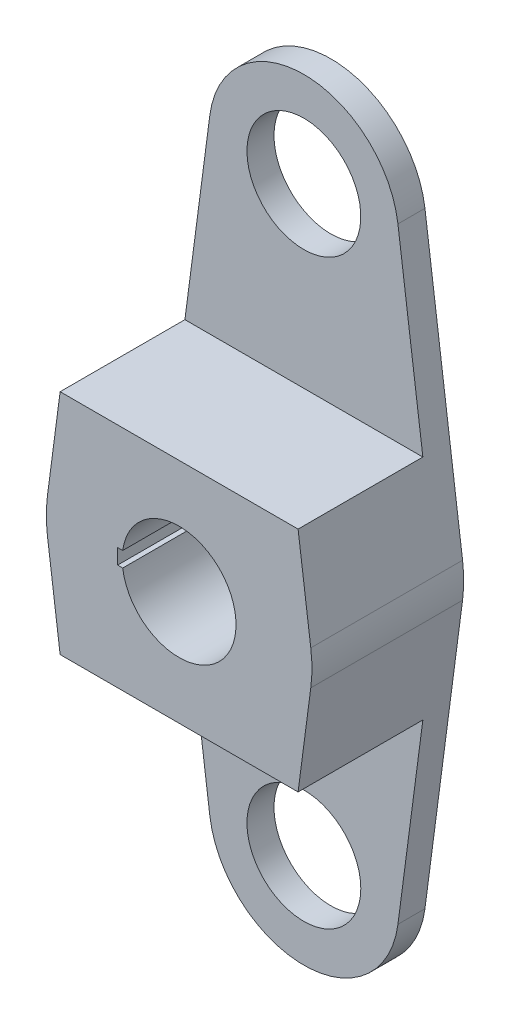
ISO-10303-21;
HEADER;
FILE_DESCRIPTION(('STEP AP214'),'2;1');
FILE_NAME('part.step','',(''),(''),'','','');
FILE_SCHEMA(('AUTOMOTIVE_DESIGN { 1 0 10303 214 1 1 1 1 }'));
ENDSEC;
DATA;
#1=APPLICATION_CONTEXT('core data for automotive mechanical design processes');
#2=APPLICATION_PROTOCOL_DEFINITION('international standard','automotive_design',2000,#1);
#3=PRODUCT_CONTEXT('',#1,'mechanical');
#4=PRODUCT('Part','Part','',(#3));
#5=PRODUCT_RELATED_PRODUCT_CATEGORY('part','',(#4));
#6=PRODUCT_DEFINITION_FORMATION('','',#4);
#7=PRODUCT_DEFINITION_CONTEXT('part definition',#1,'design');
#8=PRODUCT_DEFINITION('design','',#6,#7);
#9=PRODUCT_DEFINITION_SHAPE('','',#8);
#10=(LENGTH_UNIT() NAMED_UNIT(*) SI_UNIT(.MILLI.,.METRE.));
#11=(NAMED_UNIT(*) PLANE_ANGLE_UNIT() SI_UNIT($,.RADIAN.));
#12=(NAMED_UNIT(*) SI_UNIT($,.STERADIAN.) SOLID_ANGLE_UNIT());
#13=UNCERTAINTY_MEASURE_WITH_UNIT(LENGTH_MEASURE(1.E-05),#10,'distance_accuracy_value','');
#14=(GEOMETRIC_REPRESENTATION_CONTEXT(3) GLOBAL_UNCERTAINTY_ASSIGNED_CONTEXT((#13)) GLOBAL_UNIT_ASSIGNED_CONTEXT((#10,
#11,#12)) REPRESENTATION_CONTEXT('',''));
#15=CARTESIAN_POINT('',(0.,0.,0.));
#16=DIRECTION('',(0.,0.,1.));
#17=DIRECTION('',(1.,0.,0.));
#18=AXIS2_PLACEMENT_3D('',#15,#16,#17);
#19=CARTESIAN_POINT('',(0.,-24.34082,3.175));
#20=DIRECTION('',(0.,0.,-1.));
#21=DIRECTION('',(-1.,0.,0.));
#22=AXIS2_PLACEMENT_3D('',#19,#20,#21);
#23=CYLINDRICAL_SURFACE('',#22,7.9375);
#24=CARTESIAN_POINT('',(0.,-24.34082,-0.9144));
#25=DIRECTION('',(0.,0.,1.));
#26=DIRECTION('',(1.,0.,0.));
#27=AXIS2_PLACEMENT_3D('',#24,#25,#26);
#28=CIRCLE('',#27,7.9375);
#29=CARTESIAN_POINT('',(-7.86968433755845,-25.3761820995513,-0.9144));
#30=VERTEX_POINT('',#29);
#31=CARTESIAN_POINT('',(7.86968433755845,-25.3761820995513,-0.9144));
#32=VERTEX_POINT('',#31);
#33=EDGE_CURVE('E196',#30,#32,#28,.T.);
#34=ORIENTED_EDGE('',*,*,#33,.F.);
#35=DIRECTION('',(0.,0.,-1.));
#36=VECTOR('',#35,1.);
#37=CARTESIAN_POINT('',(-7.86968433755845,-25.3761820995513,3.175));
#38=LINE('',#37,#36);
#39=CARTESIAN_POINT('',(-7.86968433755845,-25.3761820995513,-3.175));
#40=VERTEX_POINT('',#39);
#41=EDGE_CURVE('E334',#30,#40,#38,.T.);
#42=ORIENTED_EDGE('',*,*,#41,.T.);
#43=CARTESIAN_POINT('',(0.,-24.34082,-3.175));
#44=DIRECTION('',(0.,0.,1.));
#45=DIRECTION('',(1.,0.,0.));
#46=AXIS2_PLACEMENT_3D('',#43,#44,#45);
#47=CIRCLE('',#46,7.9375);
#48=CARTESIAN_POINT('',(7.86968433755844,-25.3761820995513,-3.175));
#49=VERTEX_POINT('',#48);
#50=EDGE_CURVE('E228',#40,#49,#47,.T.);
#51=ORIENTED_EDGE('',*,*,#50,.T.);
#52=DIRECTION('',(0.,0.,-1.));
#53=VECTOR('',#52,1.);
#54=CARTESIAN_POINT('',(7.86968433755845,-25.3761820995513,3.175));
#55=LINE('',#54,#53);
#56=EDGE_CURVE('E331',#32,#49,#55,.T.);
#57=ORIENTED_EDGE('',*,*,#56,.F.);
#58=EDGE_LOOP('',(#34,#42,#51,#57));
#59=FACE_BOUND('',#58,.T.);
#60=ADVANCED_FACE('F44',(#59),#23,.T.);
#61=CARTESIAN_POINT('',(0.,-24.34082,3.175));
#62=DIRECTION('',(0.,0.,-1.));
#63=DIRECTION('',(-1.,0.,0.));
#64=AXIS2_PLACEMENT_3D('',#61,#62,#63);
#65=CYLINDRICAL_SURFACE('',#64,4.7625);
#66=CARTESIAN_POINT('',(0.,-24.34082,-3.175));
#67=DIRECTION('',(0.,0.,1.));
#68=DIRECTION('',(1.,0.,0.));
#69=AXIS2_PLACEMENT_3D('',#66,#67,#68);
#70=CIRCLE('',#69,4.7625);
#71=CARTESIAN_POINT('',(4.7625,-24.34082,-3.175));
#72=VERTEX_POINT('',#71);
#73=EDGE_CURVE('E224',#72,#72,#70,.T.);
#74=ORIENTED_EDGE('',*,*,#73,.F.);
#75=EDGE_LOOP('',(#74));
#76=FACE_BOUND('',#75,.T.);
#77=CARTESIAN_POINT('',(0.,-24.34082,-0.9144));
#78=DIRECTION('',(0.,0.,1.));
#79=DIRECTION('',(1.,0.,0.));
#80=AXIS2_PLACEMENT_3D('',#77,#78,#79);
#81=CIRCLE('',#80,4.7625);
#82=CARTESIAN_POINT('',(4.7625,-24.34082,-0.9144));
#83=VERTEX_POINT('',#82);
#84=EDGE_CURVE('E229',#83,#83,#81,.T.);
#85=ORIENTED_EDGE('',*,*,#84,.T.);
#86=EDGE_LOOP('',(#85));
#87=FACE_BOUND('',#86,.T.);
#88=ADVANCED_FACE('F46',(#76,#87),#65,.F.);
#89=CARTESIAN_POINT('',(-11.0175580725818,1.4495069393718,3.175));
#90=DIRECTION('',(-0.991456294495552,0.130439319628509,0.));
#91=DIRECTION('',(-0.130439319628509,-0.991456294495553,0.));
#92=AXIS2_PLACEMENT_3D('',#89,#90,#91);
#93=PLANE('',#92);
#94=DIRECTION('',(0.,0.,-1.));
#95=VECTOR('',#94,1.);
#96=CARTESIAN_POINT('',(-9.95511908627328,9.525,9.525));
#97=LINE('',#96,#95);
#98=CARTESIAN_POINT('',(-9.95511908627328,9.525,9.525));
#99=VERTEX_POINT('',#98);
#100=CARTESIAN_POINT('',(-9.95511908627327,9.525,-0.9144));
#101=VERTEX_POINT('',#100);
#102=EDGE_CURVE('E272',#99,#101,#97,.T.);
#103=ORIENTED_EDGE('',*,*,#102,.T.);
#104=DIRECTION('',(-0.130439319628509,-0.991456294495553,0.));
#105=VECTOR('',#104,1.);
#106=CARTESIAN_POINT('',(-7.86968433755844,25.3761820995513,-0.9144));
#107=LINE('',#106,#105);
#108=CARTESIAN_POINT('',(-7.86968433755844,25.3761820995513,-0.9144));
#109=VERTEX_POINT('',#108);
#110=EDGE_CURVE('E218',#109,#101,#107,.T.);
#111=ORIENTED_EDGE('',*,*,#110,.F.);
#112=DIRECTION('',(0.,0.,-1.));
#113=VECTOR('',#112,1.);
#114=CARTESIAN_POINT('',(-7.86968433755845,25.3761820995513,3.175));
#115=LINE('',#114,#113);
#116=CARTESIAN_POINT('',(-7.86968433755845,25.3761820995513,-3.175));
#117=VERTEX_POINT('',#116);
#118=EDGE_CURVE('E319',#109,#117,#115,.T.);
#119=ORIENTED_EDGE('',*,*,#118,.T.);
#120=DIRECTION('',(0.130439319628509,0.991456294495553,0.));
#121=VECTOR('',#120,1.);
#122=CARTESIAN_POINT('',(-9.95511908627328,9.525,-3.175));
#123=LINE('',#122,#121);
#124=CARTESIAN_POINT('',(-11.0175580725818,1.4495069393718,-3.175));
#125=VERTEX_POINT('',#124);
#126=EDGE_CURVE('E311',#125,#117,#123,.T.);
#127=ORIENTED_EDGE('',*,*,#126,.F.);
#128=DIRECTION('',(0.,0.,-1.));
#129=VECTOR('',#128,1.);
#130=CARTESIAN_POINT('',(-11.0175580725818,1.4495069393718,3.175));
#131=LINE('',#130,#129);
#132=CARTESIAN_POINT('',(-11.0175580725818,1.44950693937181,9.525));
#133=VERTEX_POINT('',#132);
#134=EDGE_CURVE('E53',#133,#125,#131,.T.);
#135=ORIENTED_EDGE('',*,*,#134,.F.);
#136=DIRECTION('',(-0.130439319628509,-0.991456294495553,0.));
#137=VECTOR('',#136,1.);
#138=CARTESIAN_POINT('',(-9.95511908627328,9.525,9.525));
#139=LINE('',#138,#137);
#140=EDGE_CURVE('E244',#99,#133,#139,.T.);
#141=ORIENTED_EDGE('',*,*,#140,.F.);
#142=EDGE_LOOP('',(#103,#111,#119,#127,#135,#141));
#143=FACE_BOUND('',#142,.T.);
#144=ADVANCED_FACE('F393',(#143),#93,.T.);
#145=CARTESIAN_POINT('',(0.,0.,3.175));
#146=DIRECTION('',(0.,0.,-1.));
#147=DIRECTION('',(-1.,0.,0.));
#148=AXIS2_PLACEMENT_3D('',#145,#146,#147);
#149=CYLINDRICAL_SURFACE('',#148,11.1125);
#150=ORIENTED_EDGE('',*,*,#134,.T.);
#151=CARTESIAN_POINT('',(-1.85615411929518E-13,0.,-3.175));
#152=DIRECTION('',(0.,0.,-1.));
#153=DIRECTION('',(1.,0.,0.));
#154=AXIS2_PLACEMENT_3D('',#151,#152,#153);
#155=CIRCLE('',#154,11.1124999999998);
#156=CARTESIAN_POINT('',(-11.0175580725818,-1.4495069393718,-3.175));
#157=VERTEX_POINT('',#156);
#158=EDGE_CURVE('E308',#157,#125,#155,.T.);
#159=ORIENTED_EDGE('',*,*,#158,.F.);
#160=DIRECTION('',(0.,0.,-1.));
#161=VECTOR('',#160,1.);
#162=CARTESIAN_POINT('',(-11.0175580725818,-1.4495069393718,3.175));
#163=LINE('',#162,#161);
#164=CARTESIAN_POINT('',(-11.0175580725818,-1.4495069393718,9.525));
#165=VERTEX_POINT('',#164);
#166=EDGE_CURVE('E337',#165,#157,#163,.T.);
#167=ORIENTED_EDGE('',*,*,#166,.F.);
#168=CARTESIAN_POINT('',(0.,0.,9.525));
#169=DIRECTION('',(0.,0.,1.));
#170=DIRECTION('',(1.,0.,0.));
#171=AXIS2_PLACEMENT_3D('',#168,#169,#170);
#172=CIRCLE('',#171,11.1125);
#173=EDGE_CURVE('E248',#133,#165,#172,.T.);
#174=ORIENTED_EDGE('',*,*,#173,.F.);
#175=EDGE_LOOP('',(#150,#159,#167,#174));
#176=FACE_BOUND('',#175,.T.);
#177=ADVANCED_FACE('F395',(#176),#149,.T.);
#178=CARTESIAN_POINT('',(-11.0175580725818,-1.44950693937181,3.175));
#179=DIRECTION('',(-0.991456294495552,-0.130439319628509,0.));
#180=DIRECTION('',(0.130439319628509,-0.991456294495553,0.));
#181=AXIS2_PLACEMENT_3D('',#178,#179,#180);
#182=PLANE('',#181);
#183=DIRECTION('',(0.130439319628509,-0.991456294495553,0.));
#184=VECTOR('',#183,1.);
#185=CARTESIAN_POINT('',(-7.86968433755845,-25.3761820995513,-0.9144));
#186=LINE('',#185,#184);
#187=CARTESIAN_POINT('',(-9.95511908627327,-9.525,-0.9144));
#188=VERTEX_POINT('',#187);
#189=EDGE_CURVE('E208',#188,#30,#186,.T.);
#190=ORIENTED_EDGE('',*,*,#189,.F.);
#191=DIRECTION('',(0.,0.,-1.));
#192=VECTOR('',#191,1.);
#193=CARTESIAN_POINT('',(-9.95511908627327,-9.525,9.525));
#194=LINE('',#193,#192);
#195=CARTESIAN_POINT('',(-9.95511908627327,-9.525,9.525));
#196=VERTEX_POINT('',#195);
#197=EDGE_CURVE('E281',#196,#188,#194,.T.);
#198=ORIENTED_EDGE('',*,*,#197,.F.);
#199=DIRECTION('',(0.130439319628509,-0.991456294495552,0.));
#200=VECTOR('',#199,1.);
#201=CARTESIAN_POINT('',(-9.95511908627327,-9.525,9.525));
#202=LINE('',#201,#200);
#203=EDGE_CURVE('E252',#165,#196,#202,.T.);
#204=ORIENTED_EDGE('',*,*,#203,.F.);
#205=ORIENTED_EDGE('',*,*,#166,.T.);
#206=DIRECTION('',(-0.130439319628509,0.991456294495552,0.));
#207=VECTOR('',#206,1.);
#208=CARTESIAN_POINT('',(-11.0175580725818,-1.4495069393718,-3.175));
#209=LINE('',#208,#207);
#210=EDGE_CURVE('E304',#40,#157,#209,.T.);
#211=ORIENTED_EDGE('',*,*,#210,.F.);
#212=ORIENTED_EDGE('',*,*,#41,.F.);
#213=EDGE_LOOP('',(#190,#198,#204,#205,#211,#212));
#214=FACE_BOUND('',#213,.T.);
#215=ADVANCED_FACE('F399',(#214),#182,.T.);
#216=CARTESIAN_POINT('',(11.0175580725818,-1.4495069393718,3.175));
#217=DIRECTION('',(0.991456294495552,-0.130439319628509,0.));
#218=DIRECTION('',(0.130439319628509,0.991456294495553,0.));
#219=AXIS2_PLACEMENT_3D('',#216,#217,#218);
#220=PLANE('',#219);
#221=DIRECTION('',(0.,0.,-1.));
#222=VECTOR('',#221,1.);
#223=CARTESIAN_POINT('',(9.95511908627328,-9.525,9.525));
#224=LINE('',#223,#222);
#225=CARTESIAN_POINT('',(9.95511908627328,-9.525,9.525));
#226=VERTEX_POINT('',#225);
#227=CARTESIAN_POINT('',(9.95511908627328,-9.525,-0.9144));
#228=VERTEX_POINT('',#227);
#229=EDGE_CURVE('E278',#226,#228,#224,.T.);
#230=ORIENTED_EDGE('',*,*,#229,.T.);
#231=DIRECTION('',(0.130439319628509,0.991456294495553,0.));
#232=VECTOR('',#231,1.);
#233=CARTESIAN_POINT('',(9.95511908627328,-9.525,-0.9144));
#234=LINE('',#233,#232);
#235=EDGE_CURVE('E199',#32,#228,#234,.T.);
#236=ORIENTED_EDGE('',*,*,#235,.F.);
#237=ORIENTED_EDGE('',*,*,#56,.T.);
#238=DIRECTION('',(-0.130439319628509,-0.991456294495552,0.));
#239=VECTOR('',#238,1.);
#240=CARTESIAN_POINT('',(9.95511908627327,-9.525,-3.175));
#241=LINE('',#240,#239);
#242=CARTESIAN_POINT('',(11.0175580725818,-1.4495069393718,-3.175));
#243=VERTEX_POINT('',#242);
#244=EDGE_CURVE('E300',#243,#49,#241,.T.);
#245=ORIENTED_EDGE('',*,*,#244,.F.);
#246=DIRECTION('',(0.,0.,-1.));
#247=VECTOR('',#246,1.);
#248=CARTESIAN_POINT('',(11.0175580725818,-1.4495069393718,3.175));
#249=LINE('',#248,#247);
#250=CARTESIAN_POINT('',(11.0175580725818,-1.4495069393718,9.525));
#251=VERTEX_POINT('',#250);
#252=EDGE_CURVE('E328',#251,#243,#249,.T.);
#253=ORIENTED_EDGE('',*,*,#252,.F.);
#254=DIRECTION('',(0.130439319628509,0.991456294495553,0.));
#255=VECTOR('',#254,1.);
#256=CARTESIAN_POINT('',(9.95511908627328,-9.525,9.525));
#257=LINE('',#256,#255);
#258=EDGE_CURVE('E258',#226,#251,#257,.T.);
#259=ORIENTED_EDGE('',*,*,#258,.F.);
#260=EDGE_LOOP('',(#230,#236,#237,#245,#253,#259));
#261=FACE_BOUND('',#260,.T.);
#262=ADVANCED_FACE('F362',(#261),#220,.T.);
#263=CARTESIAN_POINT('',(0.,0.,3.175));
#264=DIRECTION('',(0.,0.,-1.));
#265=DIRECTION('',(-1.,0.,0.));
#266=AXIS2_PLACEMENT_3D('',#263,#264,#265);
#267=CYLINDRICAL_SURFACE('',#266,11.1125);
#268=ORIENTED_EDGE('',*,*,#252,.T.);
#269=CARTESIAN_POINT('',(0.,0.,-3.175));
#270=DIRECTION('',(0.,0.,-1.));
#271=DIRECTION('',(1.,0.,0.));
#272=AXIS2_PLACEMENT_3D('',#269,#270,#271);
#273=CIRCLE('',#272,11.1125000000001);
#274=CARTESIAN_POINT('',(11.0175580725818,1.44950693937181,-3.175));
#275=VERTEX_POINT('',#274);
#276=EDGE_CURVE('E296',#275,#243,#273,.T.);
#277=ORIENTED_EDGE('',*,*,#276,.F.);
#278=DIRECTION('',(0.,0.,-1.));
#279=VECTOR('',#278,1.);
#280=CARTESIAN_POINT('',(11.0175580725818,1.44950693937181,3.175));
#281=LINE('',#280,#279);
#282=CARTESIAN_POINT('',(11.0175580725818,1.44950693937181,9.525));
#283=VERTEX_POINT('',#282);
#284=EDGE_CURVE('E325',#283,#275,#281,.T.);
#285=ORIENTED_EDGE('',*,*,#284,.F.);
#286=CARTESIAN_POINT('',(4.82253126321552E-13,0.,9.525));
#287=DIRECTION('',(0.,0.,1.));
#288=DIRECTION('',(-1.,0.,0.));
#289=AXIS2_PLACEMENT_3D('',#286,#287,#288);
#290=CIRCLE('',#289,11.1124999999995);
#291=EDGE_CURVE('E262',#251,#283,#290,.T.);
#292=ORIENTED_EDGE('',*,*,#291,.F.);
#293=EDGE_LOOP('',(#268,#277,#285,#292));
#294=FACE_BOUND('',#293,.T.);
#295=ADVANCED_FACE('F377',(#294),#267,.T.);
#296=CARTESIAN_POINT('',(11.0175580725818,1.4495069393718,3.175));
#297=DIRECTION('',(0.991456294495552,0.130439319628509,0.));
#298=DIRECTION('',(-0.130439319628509,0.991456294495553,0.));
#299=AXIS2_PLACEMENT_3D('',#296,#297,#298);
#300=PLANE('',#299);
#301=DIRECTION('',(-0.130439319628509,0.991456294495553,0.));
#302=VECTOR('',#301,1.);
#303=CARTESIAN_POINT('',(9.95511908627327,9.525,-0.9144));
#304=LINE('',#303,#302);
#305=CARTESIAN_POINT('',(9.95511908627327,9.525,-0.9144));
#306=VERTEX_POINT('',#305);
#307=CARTESIAN_POINT('',(7.86968433755844,25.3761820995513,-0.9144));
#308=VERTEX_POINT('',#307);
#309=EDGE_CURVE('E195',#306,#308,#304,.T.);
#310=ORIENTED_EDGE('',*,*,#309,.F.);
#311=DIRECTION('',(0.,0.,-1.));
#312=VECTOR('',#311,1.);
#313=CARTESIAN_POINT('',(9.95511908627327,9.525,9.525));
#314=LINE('',#313,#312);
#315=CARTESIAN_POINT('',(9.95511908627327,9.525,9.525));
#316=VERTEX_POINT('',#315);
#317=EDGE_CURVE('E275',#316,#306,#314,.T.);
#318=ORIENTED_EDGE('',*,*,#317,.F.);
#319=DIRECTION('',(-0.130439319628509,0.991456294495552,0.));
#320=VECTOR('',#319,1.);
#321=CARTESIAN_POINT('',(9.95511908627327,9.525,9.525));
#322=LINE('',#321,#320);
#323=EDGE_CURVE('E266',#283,#316,#322,.T.);
#324=ORIENTED_EDGE('',*,*,#323,.F.);
#325=ORIENTED_EDGE('',*,*,#284,.T.);
#326=DIRECTION('',(0.130439319628509,-0.991456294495552,0.));
#327=VECTOR('',#326,1.);
#328=CARTESIAN_POINT('',(11.0175580725818,1.44950693937181,-3.175));
#329=LINE('',#328,#327);
#330=CARTESIAN_POINT('',(7.86968433755844,25.3761820995513,-3.175));
#331=VERTEX_POINT('',#330);
#332=EDGE_CURVE('E289',#331,#275,#329,.T.);
#333=ORIENTED_EDGE('',*,*,#332,.F.);
#334=DIRECTION('',(0.,0.,-1.));
#335=VECTOR('',#334,1.);
#336=CARTESIAN_POINT('',(7.86968433755844,25.3761820995513,3.175));
#337=LINE('',#336,#335);
#338=EDGE_CURVE('E322',#308,#331,#337,.T.);
#339=ORIENTED_EDGE('',*,*,#338,.F.);
#340=EDGE_LOOP('',(#310,#318,#324,#325,#333,#339));
#341=FACE_BOUND('',#340,.T.);
#342=ADVANCED_FACE('F381',(#341),#300,.T.);
#343=CARTESIAN_POINT('',(0.,0.,3.175));
#344=DIRECTION('',(0.,0.,-1.));
#345=DIRECTION('',(-1.,0.,0.));
#346=AXIS2_PLACEMENT_3D('',#343,#344,#345);
#347=CYLINDRICAL_SURFACE('',#346,4.7625);
#348=DIRECTION('',(0.,0.,-1.));
#349=VECTOR('',#348,1.);
#350=CARTESIAN_POINT('',(-4.71997682727363,-0.635000000000001,3.175));
#351=LINE('',#350,#349);
#352=CARTESIAN_POINT('',(-4.7199768272736,-0.635000000000001,9.525));
#353=VERTEX_POINT('',#352);
#354=CARTESIAN_POINT('',(-4.71997682727363,-0.635000000000001,0.));
#355=VERTEX_POINT('',#354);
#356=EDGE_CURVE('E192',#353,#355,#351,.T.);
#357=ORIENTED_EDGE('',*,*,#356,.F.);
#358=CARTESIAN_POINT('',(0.,0.,9.525));
#359=DIRECTION('',(0.,0.,1.));
#360=DIRECTION('',(1.,0.,0.));
#361=AXIS2_PLACEMENT_3D('',#358,#359,#360);
#362=CIRCLE('',#361,4.76249999999999);
#363=CARTESIAN_POINT('',(-4.7199768272736,0.634999999999999,9.525));
#364=VERTEX_POINT('',#363);
#365=EDGE_CURVE('E241',#353,#364,#362,.T.);
#366=ORIENTED_EDGE('',*,*,#365,.T.);
#367=DIRECTION('',(0.,0.,-1.));
#368=VECTOR('',#367,1.);
#369=CARTESIAN_POINT('',(-4.71997682727363,0.634999999999999,3.175));
#370=LINE('',#369,#368);
#371=CARTESIAN_POINT('',(-4.71997682727363,0.634999999999999,0.));
#372=VERTEX_POINT('',#371);
#373=EDGE_CURVE('E59',#372,#364,#370,.F.);
#374=ORIENTED_EDGE('',*,*,#373,.F.);
#375=CARTESIAN_POINT('',(0.,0.,0.));
#376=DIRECTION('',(0.,0.,1.));
#377=DIRECTION('',(1.,0.,0.));
#378=AXIS2_PLACEMENT_3D('',#375,#376,#377);
#379=CIRCLE('',#378,4.7625);
#380=EDGE_CURVE('E315',#355,#372,#379,.T.);
#381=ORIENTED_EDGE('',*,*,#380,.F.);
#382=EDGE_LOOP('',(#357,#366,#374,#381));
#383=FACE_BOUND('',#382,.T.);
#384=ADVANCED_FACE('F456',(#383),#347,.F.);
#385=CARTESIAN_POINT('',(0.,24.34082,3.175));
#386=DIRECTION('',(0.,0.,-1.));
#387=DIRECTION('',(-1.,0.,0.));
#388=AXIS2_PLACEMENT_3D('',#385,#386,#387);
#389=CYLINDRICAL_SURFACE('',#388,7.9375);
#390=ORIENTED_EDGE('',*,*,#118,.F.);
#391=CARTESIAN_POINT('',(0.,24.34082,-0.9144));
#392=DIRECTION('',(0.,0.,1.));
#393=DIRECTION('',(-1.,0.,0.));
#394=AXIS2_PLACEMENT_3D('',#391,#392,#393);
#395=CIRCLE('',#394,7.93749999999999);
#396=EDGE_CURVE('E200',#308,#109,#395,.T.);
#397=ORIENTED_EDGE('',*,*,#396,.F.);
#398=ORIENTED_EDGE('',*,*,#338,.T.);
#399=CARTESIAN_POINT('',(0.,24.34082,-3.175));
#400=DIRECTION('',(0.,0.,1.));
#401=DIRECTION('',(1.,0.,0.));
#402=AXIS2_PLACEMENT_3D('',#399,#400,#401);
#403=CIRCLE('',#402,7.9375);
#404=EDGE_CURVE('E233',#331,#117,#403,.T.);
#405=ORIENTED_EDGE('',*,*,#404,.T.);
#406=EDGE_LOOP('',(#390,#397,#398,#405));
#407=FACE_BOUND('',#406,.T.);
#408=ADVANCED_FACE('F465',(#407),#389,.T.);
#409=CARTESIAN_POINT('',(0.,24.34082,3.175));
#410=DIRECTION('',(0.,0.,-1.));
#411=DIRECTION('',(-1.,0.,0.));
#412=AXIS2_PLACEMENT_3D('',#409,#410,#411);
#413=CYLINDRICAL_SURFACE('',#412,4.7625);
#414=CARTESIAN_POINT('',(0.,24.34082,-0.9144));
#415=DIRECTION('',(0.,0.,-1.));
#416=DIRECTION('',(-1.,0.,0.));
#417=AXIS2_PLACEMENT_3D('',#414,#415,#416);
#418=CIRCLE('',#417,4.7625);
#419=CARTESIAN_POINT('',(-4.7625,24.34082,-0.9144));
#420=VERTEX_POINT('',#419);
#421=EDGE_CURVE('E211',#420,#420,#418,.T.);
#422=ORIENTED_EDGE('',*,*,#421,.F.);
#423=EDGE_LOOP('',(#422));
#424=FACE_BOUND('',#423,.T.);
#425=CARTESIAN_POINT('',(0.,24.34082,-3.175));
#426=DIRECTION('',(0.,0.,1.));
#427=DIRECTION('',(1.,0.,0.));
#428=AXIS2_PLACEMENT_3D('',#425,#426,#427);
#429=CIRCLE('',#428,4.7625);
#430=CARTESIAN_POINT('',(4.7625,24.34082,-3.175));
#431=VERTEX_POINT('',#430);
#432=EDGE_CURVE('E237',#431,#431,#429,.T.);
#433=ORIENTED_EDGE('',*,*,#432,.F.);
#434=EDGE_LOOP('',(#433));
#435=FACE_BOUND('',#434,.T.);
#436=ADVANCED_FACE('F478',(#424,#435),#413,.F.);
#437=CARTESIAN_POINT('',(-1.85615411929518E-13,0.,-3.175));
#438=DIRECTION('',(0.,0.,1.));
#439=DIRECTION('',(1.,0.,0.));
#440=AXIS2_PLACEMENT_3D('',#437,#438,#439);
#441=PLANE('',#440);
#442=ORIENTED_EDGE('',*,*,#332,.T.);
#443=ORIENTED_EDGE('',*,*,#276,.T.);
#444=ORIENTED_EDGE('',*,*,#244,.T.);
#445=ORIENTED_EDGE('',*,*,#50,.F.);
#446=ORIENTED_EDGE('',*,*,#210,.T.);
#447=ORIENTED_EDGE('',*,*,#158,.T.);
#448=ORIENTED_EDGE('',*,*,#126,.T.);
#449=ORIENTED_EDGE('',*,*,#404,.F.);
#450=EDGE_LOOP('',(#442,#443,#444,#445,#446,#447,#448,#449));
#451=FACE_BOUND('',#450,.T.);
#452=CARTESIAN_POINT('',(-1.85615411929518E-13,0.,-3.175));
#453=DIRECTION('',(0.,0.,-1.));
#454=DIRECTION('',(-1.,0.,0.));
#455=AXIS2_PLACEMENT_3D('',#452,#453,#454);
#456=CIRCLE('',#455,3.175);
#457=CARTESIAN_POINT('',(-3.17500000000019,0.,-3.175));
#458=VERTEX_POINT('',#457);
#459=EDGE_CURVE('E285',#458,#458,#456,.T.);
#460=ORIENTED_EDGE('',*,*,#459,.F.);
#461=EDGE_LOOP('',(#460));
#462=FACE_BOUND('',#461,.T.);
#463=ORIENTED_EDGE('',*,*,#432,.T.);
#464=EDGE_LOOP('',(#463));
#465=FACE_BOUND('',#464,.T.);
#466=ORIENTED_EDGE('',*,*,#73,.T.);
#467=EDGE_LOOP('',(#466));
#468=FACE_BOUND('',#467,.T.);
#469=ADVANCED_FACE('F370',(#451,#462,#465,#468),#441,.F.);
#470=CARTESIAN_POINT('',(-1.85615411929518E-13,0.,0.));
#471=DIRECTION('',(0.,0.,1.));
#472=DIRECTION('',(1.,0.,0.));
#473=AXIS2_PLACEMENT_3D('',#470,#471,#472);
#474=PLANE('',#473);
#475=ORIENTED_EDGE('',*,*,#380,.T.);
#476=DIRECTION('',(1.,0.,0.));
#477=VECTOR('',#476,1.);
#478=CARTESIAN_POINT('',(-5.1435,0.634999999999999,0.));
#479=LINE('',#478,#477);
#480=CARTESIAN_POINT('',(-5.1435,0.634999999999999,0.));
#481=VERTEX_POINT('',#480);
#482=EDGE_CURVE('E187',#481,#372,#479,.T.);
#483=ORIENTED_EDGE('',*,*,#482,.F.);
#484=DIRECTION('',(0.,1.,0.));
#485=VECTOR('',#484,1.);
#486=CARTESIAN_POINT('',(-5.1435,-0.635000000000001,0.));
#487=LINE('',#486,#485);
#488=CARTESIAN_POINT('',(-5.1435,-0.635000000000001,0.));
#489=VERTEX_POINT('',#488);
#490=EDGE_CURVE('E170',#489,#481,#487,.T.);
#491=ORIENTED_EDGE('',*,*,#490,.F.);
#492=DIRECTION('',(-1.,0.,0.));
#493=VECTOR('',#492,1.);
#494=CARTESIAN_POINT('',(-5.1435,-0.635000000000001,0.));
#495=LINE('',#494,#493);
#496=EDGE_CURVE('E182',#355,#489,#495,.T.);
#497=ORIENTED_EDGE('',*,*,#496,.F.);
#498=EDGE_LOOP('',(#475,#483,#491,#497));
#499=FACE_BOUND('',#498,.T.);
#500=CARTESIAN_POINT('',(-1.85615411929518E-13,0.,0.));
#501=DIRECTION('',(0.,0.,-1.));
#502=DIRECTION('',(-1.,0.,0.));
#503=AXIS2_PLACEMENT_3D('',#500,#501,#502);
#504=CIRCLE('',#503,3.175);
#505=CARTESIAN_POINT('',(-3.17500000000019,0.,0.));
#506=VERTEX_POINT('',#505);
#507=EDGE_CURVE('E284',#506,#506,#504,.T.);
#508=ORIENTED_EDGE('',*,*,#507,.T.);
#509=EDGE_LOOP('',(#508));
#510=FACE_BOUND('',#509,.T.);
#511=ADVANCED_FACE('F492',(#499,#510),#474,.T.);
#512=CARTESIAN_POINT('',(-1.85615411929518E-13,0.,-3.175));
#513=DIRECTION('',(0.,0.,1.));
#514=DIRECTION('',(1.,0.,0.));
#515=AXIS2_PLACEMENT_3D('',#512,#513,#514);
#516=CYLINDRICAL_SURFACE('',#515,3.175);
#517=ORIENTED_EDGE('',*,*,#459,.T.);
#518=EDGE_LOOP('',(#517));
#519=FACE_BOUND('',#518,.T.);
#520=ORIENTED_EDGE('',*,*,#507,.F.);
#521=EDGE_LOOP('',(#520));
#522=FACE_BOUND('',#521,.T.);
#523=ADVANCED_FACE('F410',(#519,#522),#516,.F.);
#524=CARTESIAN_POINT('',(0.,0.,9.525));
#525=DIRECTION('',(0.,0.,1.));
#526=DIRECTION('',(1.,0.,0.));
#527=AXIS2_PLACEMENT_3D('',#524,#525,#526);
#528=PLANE('',#527);
#529=DIRECTION('',(1.,0.,0.));
#530=VECTOR('',#529,1.);
#531=CARTESIAN_POINT('',(-5.1435,-0.635000000000001,9.525));
#532=LINE('',#531,#530);
#533=CARTESIAN_POINT('',(-5.1435,-0.635000000000001,9.525));
#534=VERTEX_POINT('',#533);
#535=EDGE_CURVE('E173',#534,#353,#532,.T.);
#536=ORIENTED_EDGE('',*,*,#535,.F.);
#537=DIRECTION('',(0.,-1.,0.));
#538=VECTOR('',#537,1.);
#539=CARTESIAN_POINT('',(-5.1435,-0.635000000000001,9.525));
#540=LINE('',#539,#538);
#541=CARTESIAN_POINT('',(-5.1435,0.634999999999999,9.525));
#542=VERTEX_POINT('',#541);
#543=EDGE_CURVE('E167',#542,#534,#540,.T.);
#544=ORIENTED_EDGE('',*,*,#543,.F.);
#545=DIRECTION('',(-1.,0.,0.));
#546=VECTOR('',#545,1.);
#547=CARTESIAN_POINT('',(0.,0.634999999999999,9.525));
#548=LINE('',#547,#546);
#549=EDGE_CURVE('E11',#364,#542,#548,.T.);
#550=ORIENTED_EDGE('',*,*,#549,.F.);
#551=ORIENTED_EDGE('',*,*,#365,.F.);
#552=EDGE_LOOP('',(#536,#544,#550,#551));
#553=FACE_BOUND('',#552,.T.);
#554=ORIENTED_EDGE('',*,*,#140,.T.);
#555=ORIENTED_EDGE('',*,*,#173,.T.);
#556=ORIENTED_EDGE('',*,*,#203,.T.);
#557=DIRECTION('',(1.,0.,0.));
#558=VECTOR('',#557,1.);
#559=CARTESIAN_POINT('',(-9.95511908627327,-9.525,9.525));
#560=LINE('',#559,#558);
#561=EDGE_CURVE('E255',#196,#226,#560,.T.);
#562=ORIENTED_EDGE('',*,*,#561,.T.);
#563=ORIENTED_EDGE('',*,*,#258,.T.);
#564=ORIENTED_EDGE('',*,*,#291,.T.);
#565=ORIENTED_EDGE('',*,*,#323,.T.);
#566=DIRECTION('',(-1.,0.,0.));
#567=VECTOR('',#566,1.);
#568=CARTESIAN_POINT('',(-9.95511908627328,9.525,9.525));
#569=LINE('',#568,#567);
#570=EDGE_CURVE('E269',#316,#99,#569,.T.);
#571=ORIENTED_EDGE('',*,*,#570,.T.);
#572=EDGE_LOOP('',(#554,#555,#556,#562,#563,#564,#565,#571));
#573=FACE_BOUND('',#572,.T.);
#574=ADVANCED_FACE('F175',(#553,#573),#528,.T.);
#575=CARTESIAN_POINT('',(-9.95511908627327,-9.525,9.525));
#576=DIRECTION('',(0.,1.,0.));
#577=DIRECTION('',(-1.,0.,0.));
#578=AXIS2_PLACEMENT_3D('',#575,#576,#577);
#579=PLANE('',#578);
#580=ORIENTED_EDGE('',*,*,#197,.T.);
#581=DIRECTION('',(-1.,0.,0.));
#582=VECTOR('',#581,1.);
#583=CARTESIAN_POINT('',(-9.95511908627327,-9.525,-0.9144));
#584=LINE('',#583,#582);
#585=EDGE_CURVE('E204',#228,#188,#584,.T.);
#586=ORIENTED_EDGE('',*,*,#585,.F.);
#587=ORIENTED_EDGE('',*,*,#229,.F.);
#588=ORIENTED_EDGE('',*,*,#561,.F.);
#589=EDGE_LOOP('',(#580,#586,#587,#588));
#590=FACE_BOUND('',#589,.T.);
#591=ADVANCED_FACE('F401',(#590),#579,.F.);
#592=CARTESIAN_POINT('',(-9.95511908627328,9.525,9.525));
#593=DIRECTION('',(0.,-1.,0.));
#594=DIRECTION('',(1.,0.,0.));
#595=AXIS2_PLACEMENT_3D('',#592,#593,#594);
#596=PLANE('',#595);
#597=ORIENTED_EDGE('',*,*,#317,.T.);
#598=DIRECTION('',(1.,0.,0.));
#599=VECTOR('',#598,1.);
#600=CARTESIAN_POINT('',(-9.95511908627327,9.525,-0.9144));
#601=LINE('',#600,#599);
#602=EDGE_CURVE('E214',#101,#306,#601,.T.);
#603=ORIENTED_EDGE('',*,*,#602,.F.);
#604=ORIENTED_EDGE('',*,*,#102,.F.);
#605=ORIENTED_EDGE('',*,*,#570,.F.);
#606=EDGE_LOOP('',(#597,#603,#604,#605));
#607=FACE_BOUND('',#606,.T.);
#608=ADVANCED_FACE('F390',(#607),#596,.F.);
#609=CARTESIAN_POINT('',(0.,24.34082,-0.9144));
#610=DIRECTION('',(0.,0.,-1.));
#611=DIRECTION('',(-1.,0.,0.));
#612=AXIS2_PLACEMENT_3D('',#609,#610,#611);
#613=PLANE('',#612);
#614=ORIENTED_EDGE('',*,*,#421,.T.);
#615=EDGE_LOOP('',(#614));
#616=FACE_BOUND('',#615,.T.);
#617=ORIENTED_EDGE('',*,*,#396,.T.);
#618=ORIENTED_EDGE('',*,*,#110,.T.);
#619=ORIENTED_EDGE('',*,*,#602,.T.);
#620=ORIENTED_EDGE('',*,*,#309,.T.);
#621=EDGE_LOOP('',(#617,#618,#619,#620));
#622=FACE_BOUND('',#621,.T.);
#623=ADVANCED_FACE('F353',(#616,#622),#613,.F.);
#624=CARTESIAN_POINT('',(0.,-24.34082,-0.9144));
#625=DIRECTION('',(0.,0.,1.));
#626=DIRECTION('',(1.,0.,0.));
#627=AXIS2_PLACEMENT_3D('',#624,#625,#626);
#628=PLANE('',#627);
#629=ORIENTED_EDGE('',*,*,#84,.F.);
#630=EDGE_LOOP('',(#629));
#631=FACE_BOUND('',#630,.T.);
#632=ORIENTED_EDGE('',*,*,#33,.T.);
#633=ORIENTED_EDGE('',*,*,#235,.T.);
#634=ORIENTED_EDGE('',*,*,#585,.T.);
#635=ORIENTED_EDGE('',*,*,#189,.T.);
#636=EDGE_LOOP('',(#632,#633,#634,#635));
#637=FACE_BOUND('',#636,.T.);
#638=ADVANCED_FACE('F349',(#631,#637),#628,.T.);
#639=CARTESIAN_POINT('',(-5.1435,-0.635000000000001,-1.4810617812907));
#640=DIRECTION('',(0.,-1.,0.));
#641=DIRECTION('',(0.,0.,-1.));
#642=AXIS2_PLACEMENT_3D('',#639,#640,#641);
#643=PLANE('',#642);
#644=ORIENTED_EDGE('',*,*,#356,.T.);
#645=ORIENTED_EDGE('',*,*,#496,.T.);
#646=DIRECTION('',(0.,0.,1.));
#647=VECTOR('',#646,1.);
#648=CARTESIAN_POINT('',(-5.1435,-0.635000000000001,-1.4810617812907));
#649=LINE('',#648,#647);
#650=EDGE_CURVE('E172',#489,#534,#649,.T.);
#651=ORIENTED_EDGE('',*,*,#650,.T.);
#652=ORIENTED_EDGE('',*,*,#535,.T.);
#653=EDGE_LOOP('',(#644,#645,#651,#652));
#654=FACE_BOUND('',#653,.T.);
#655=ADVANCED_FACE('F352',(#654),#643,.F.);
#656=CARTESIAN_POINT('',(-5.1435,-0.635000000000001,-1.4810617812907));
#657=DIRECTION('',(-1.,0.,0.));
#658=DIRECTION('',(0.,0.,1.));
#659=AXIS2_PLACEMENT_3D('',#656,#657,#658);
#660=PLANE('',#659);
#661=ORIENTED_EDGE('',*,*,#490,.T.);
#662=DIRECTION('',(0.,0.,1.));
#663=VECTOR('',#662,1.);
#664=CARTESIAN_POINT('',(-5.1435,0.634999999999999,-1.4810617812907));
#665=LINE('',#664,#663);
#666=EDGE_CURVE('E157',#481,#542,#665,.T.);
#667=ORIENTED_EDGE('',*,*,#666,.T.);
#668=ORIENTED_EDGE('',*,*,#543,.T.);
#669=ORIENTED_EDGE('',*,*,#650,.F.);
#670=EDGE_LOOP('',(#661,#667,#668,#669));
#671=FACE_BOUND('',#670,.T.);
#672=ADVANCED_FACE('F165',(#671),#660,.F.);
#673=CARTESIAN_POINT('',(-5.1435,0.634999999999999,-1.4810617812907));
#674=DIRECTION('',(0.,1.,0.));
#675=DIRECTION('',(0.,0.,1.));
#676=AXIS2_PLACEMENT_3D('',#673,#674,#675);
#677=PLANE('',#676);
#678=ORIENTED_EDGE('',*,*,#373,.T.);
#679=ORIENTED_EDGE('',*,*,#549,.T.);
#680=ORIENTED_EDGE('',*,*,#666,.F.);
#681=ORIENTED_EDGE('',*,*,#482,.T.);
#682=EDGE_LOOP('',(#678,#679,#680,#681));
#683=FACE_BOUND('',#682,.T.);
#684=ADVANCED_FACE('F156',(#683),#677,.F.);
#685=CLOSED_SHELL('',(#60,#88,#144,#177,#215,#262,#295,#342,#384,#408,#436,#469,#511,#523,#574,
#591,#608,#623,#638,#655,#672,#684));
#686=MANIFOLD_SOLID_BREP('B2',#685);
#687=ADVANCED_BREP_SHAPE_REPRESENTATION('',(#18,#686),#14);
#688=SHAPE_DEFINITION_REPRESENTATION(#9,#687);
ENDSEC;
END-ISO-10303-21;
